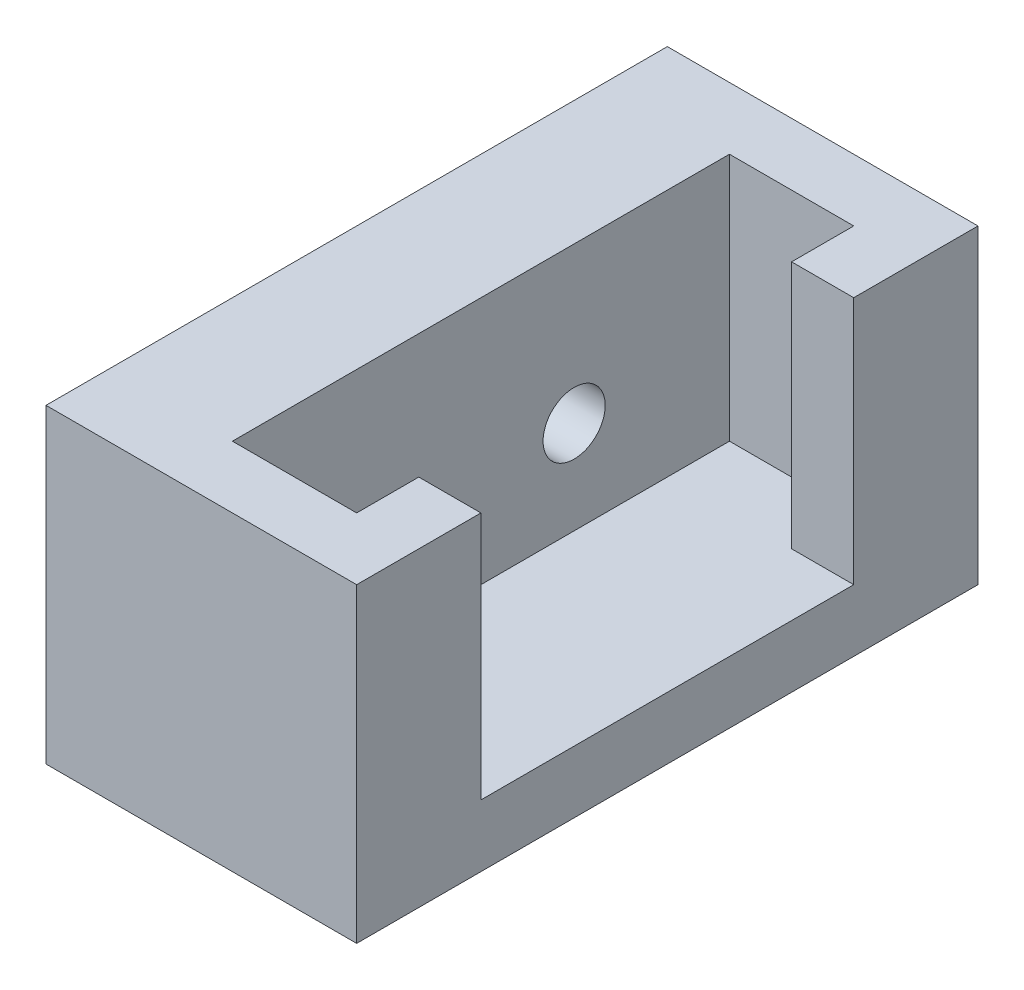
ISO-10303-21;
HEADER;
FILE_DESCRIPTION(('STEP AP214'),'2;1');
FILE_NAME('part.step','',(''),(''),'','','');
FILE_SCHEMA(('AUTOMOTIVE_DESIGN { 1 0 10303 214 1 1 1 1 }'));
ENDSEC;
DATA;
#1=APPLICATION_CONTEXT('core data for automotive mechanical design processes');
#2=APPLICATION_PROTOCOL_DEFINITION('international standard','automotive_design',2000,#1);
#3=PRODUCT_CONTEXT('',#1,'mechanical');
#4=PRODUCT('Part','Part','',(#3));
#5=PRODUCT_RELATED_PRODUCT_CATEGORY('part','',(#4));
#6=PRODUCT_DEFINITION_FORMATION('','',#4);
#7=PRODUCT_DEFINITION_CONTEXT('part definition',#1,'design');
#8=PRODUCT_DEFINITION('design','',#6,#7);
#9=PRODUCT_DEFINITION_SHAPE('','',#8);
#10=(LENGTH_UNIT() NAMED_UNIT(*) SI_UNIT(.MILLI.,.METRE.));
#11=(NAMED_UNIT(*) PLANE_ANGLE_UNIT() SI_UNIT($,.RADIAN.));
#12=(NAMED_UNIT(*) SI_UNIT($,.STERADIAN.) SOLID_ANGLE_UNIT());
#13=UNCERTAINTY_MEASURE_WITH_UNIT(LENGTH_MEASURE(1.E-05),#10,'distance_accuracy_value','');
#14=(GEOMETRIC_REPRESENTATION_CONTEXT(3) GLOBAL_UNCERTAINTY_ASSIGNED_CONTEXT((#13)) GLOBAL_UNIT_ASSIGNED_CONTEXT((#10,
#11,#12)) REPRESENTATION_CONTEXT('',''));
#15=CARTESIAN_POINT('',(0.,0.,0.));
#16=DIRECTION('',(0.,0.,1.));
#17=DIRECTION('',(1.,0.,0.));
#18=AXIS2_PLACEMENT_3D('',#15,#16,#17);
#19=CARTESIAN_POINT('',(150.,-35.,40.));
#20=DIRECTION('',(0.,0.,1.));
#21=DIRECTION('',(1.,0.,0.));
#22=AXIS2_PLACEMENT_3D('',#19,#20,#21);
#23=PLANE('',#22);
#24=DIRECTION('',(1.,0.,0.));
#25=VECTOR('',#24,1.);
#26=CARTESIAN_POINT('',(150.,-55.,40.));
#27=LINE('',#26,#25);
#28=CARTESIAN_POINT('',(145.,-55.,40.));
#29=VERTEX_POINT('',#28);
#30=CARTESIAN_POINT('',(150.,-55.,40.));
#31=VERTEX_POINT('',#30);
#32=EDGE_CURVE('E64',#29,#31,#27,.T.);
#33=ORIENTED_EDGE('',*,*,#32,.F.);
#34=DIRECTION('',(0.,-1.,0.));
#35=VECTOR('',#34,1.);
#36=CARTESIAN_POINT('',(145.,-35.,40.));
#37=LINE('',#36,#35);
#38=CARTESIAN_POINT('',(145.,-35.,40.));
#39=VERTEX_POINT('',#38);
#40=EDGE_CURVE('E191',#39,#29,#37,.T.);
#41=ORIENTED_EDGE('',*,*,#40,.F.);
#42=DIRECTION('',(-1.,0.,0.));
#43=VECTOR('',#42,1.);
#44=CARTESIAN_POINT('',(150.,-35.,40.));
#45=LINE('',#44,#43);
#46=CARTESIAN_POINT('',(150.,-35.,40.));
#47=VERTEX_POINT('',#46);
#48=EDGE_CURVE('E241',#47,#39,#45,.T.);
#49=ORIENTED_EDGE('',*,*,#48,.F.);
#50=DIRECTION('',(0.,-1.,0.));
#51=VECTOR('',#50,1.);
#52=CARTESIAN_POINT('',(150.,-35.,40.));
#53=LINE('',#52,#51);
#54=EDGE_CURVE('E60',#47,#31,#53,.T.);
#55=ORIENTED_EDGE('',*,*,#54,.T.);
#56=EDGE_LOOP('',(#33,#41,#49,#55));
#57=FACE_BOUND('',#56,.T.);
#58=ADVANCED_FACE('F43',(#57),#23,.F.);
#59=CARTESIAN_POINT('',(145.,-35.,40.));
#60=DIRECTION('',(1.,0.,0.));
#61=DIRECTION('',(0.,0.,-1.));
#62=AXIS2_PLACEMENT_3D('',#59,#60,#61);
#63=PLANE('',#62);
#64=DIRECTION('',(0.,0.,-1.));
#65=VECTOR('',#64,1.);
#66=CARTESIAN_POINT('',(145.,-55.,40.));
#67=LINE('',#66,#65);
#68=CARTESIAN_POINT('',(145.,-55.,45.));
#69=VERTEX_POINT('',#68);
#70=EDGE_CURVE('E162',#69,#29,#67,.T.);
#71=ORIENTED_EDGE('',*,*,#70,.F.);
#72=DIRECTION('',(0.,-1.,0.));
#73=VECTOR('',#72,1.);
#74=CARTESIAN_POINT('',(145.,-35.,45.));
#75=LINE('',#74,#73);
#76=CARTESIAN_POINT('',(145.,-35.,45.));
#77=VERTEX_POINT('',#76);
#78=EDGE_CURVE('E188',#77,#69,#75,.T.);
#79=ORIENTED_EDGE('',*,*,#78,.F.);
#80=DIRECTION('',(0.,0.,1.));
#81=VECTOR('',#80,1.);
#82=CARTESIAN_POINT('',(145.,-35.,40.));
#83=LINE('',#82,#81);
#84=EDGE_CURVE('E243',#39,#77,#83,.T.);
#85=ORIENTED_EDGE('',*,*,#84,.F.);
#86=ORIENTED_EDGE('',*,*,#40,.T.);
#87=EDGE_LOOP('',(#71,#79,#85,#86));
#88=FACE_BOUND('',#87,.T.);
#89=ADVANCED_FACE('F279',(#88),#63,.F.);
#90=CARTESIAN_POINT('',(145.,-35.,45.));
#91=DIRECTION('',(0.,0.,1.));
#92=DIRECTION('',(1.,0.,0.));
#93=AXIS2_PLACEMENT_3D('',#90,#91,#92);
#94=PLANE('',#93);
#95=DIRECTION('',(1.,0.,0.));
#96=VECTOR('',#95,1.);
#97=CARTESIAN_POINT('',(145.,-55.,45.));
#98=LINE('',#97,#96);
#99=CARTESIAN_POINT('',(135.,-55.,45.));
#100=VERTEX_POINT('',#99);
#101=EDGE_CURVE('E235',#100,#69,#98,.T.);
#102=ORIENTED_EDGE('',*,*,#101,.F.);
#103=DIRECTION('',(0.,-1.,0.));
#104=VECTOR('',#103,1.);
#105=CARTESIAN_POINT('',(135.,-35.,45.));
#106=LINE('',#105,#104);
#107=CARTESIAN_POINT('',(135.,-35.,45.));
#108=VERTEX_POINT('',#107);
#109=EDGE_CURVE('E185',#108,#100,#106,.T.);
#110=ORIENTED_EDGE('',*,*,#109,.F.);
#111=DIRECTION('',(-1.,0.,0.));
#112=VECTOR('',#111,1.);
#113=CARTESIAN_POINT('',(145.,-35.,45.));
#114=LINE('',#113,#112);
#115=EDGE_CURVE('E245',#77,#108,#114,.T.);
#116=ORIENTED_EDGE('',*,*,#115,.F.);
#117=ORIENTED_EDGE('',*,*,#78,.T.);
#118=EDGE_LOOP('',(#102,#110,#116,#117));
#119=FACE_BOUND('',#118,.T.);
#120=ADVANCED_FACE('F285',(#119),#94,.F.);
#121=CARTESIAN_POINT('',(135.,-35.,45.));
#122=DIRECTION('',(-1.,0.,0.));
#123=DIRECTION('',(0.,0.,1.));
#124=AXIS2_PLACEMENT_3D('',#121,#122,#123);
#125=PLANE('',#124);
#126=CARTESIAN_POINT('',(135.,-47.5,17.5));
#127=DIRECTION('',(1.,0.,0.));
#128=DIRECTION('',(0.,0.,1.));
#129=AXIS2_PLACEMENT_3D('',#126,#127,#128);
#130=CIRCLE('',#129,2.5);
#131=CARTESIAN_POINT('',(135.,-47.5,20.));
#132=VERTEX_POINT('',#131);
#133=EDGE_CURVE('E209',#132,#132,#130,.T.);
#134=ORIENTED_EDGE('',*,*,#133,.F.);
#135=EDGE_LOOP('',(#134));
#136=FACE_BOUND('',#135,.T.);
#137=CARTESIAN_POINT('',(135.,-47.5,32.5));
#138=DIRECTION('',(1.,0.,0.));
#139=DIRECTION('',(0.,0.,1.));
#140=AXIS2_PLACEMENT_3D('',#137,#138,#139);
#141=CIRCLE('',#140,2.5);
#142=CARTESIAN_POINT('',(135.,-47.5,35.));
#143=VERTEX_POINT('',#142);
#144=EDGE_CURVE('E216',#143,#143,#141,.T.);
#145=ORIENTED_EDGE('',*,*,#144,.F.);
#146=EDGE_LOOP('',(#145));
#147=FACE_BOUND('',#146,.T.);
#148=DIRECTION('',(0.,0.,1.));
#149=VECTOR('',#148,1.);
#150=CARTESIAN_POINT('',(135.,-55.,45.));
#151=LINE('',#150,#149);
#152=CARTESIAN_POINT('',(135.,-55.,5.));
#153=VERTEX_POINT('',#152);
#154=EDGE_CURVE('E232',#153,#100,#151,.T.);
#155=ORIENTED_EDGE('',*,*,#154,.F.);
#156=DIRECTION('',(0.,-1.,0.));
#157=VECTOR('',#156,1.);
#158=CARTESIAN_POINT('',(135.,-35.,5.));
#159=LINE('',#158,#157);
#160=CARTESIAN_POINT('',(135.,-35.,5.));
#161=VERTEX_POINT('',#160);
#162=EDGE_CURVE('E182',#161,#153,#159,.T.);
#163=ORIENTED_EDGE('',*,*,#162,.F.);
#164=DIRECTION('',(0.,0.,-1.));
#165=VECTOR('',#164,1.);
#166=CARTESIAN_POINT('',(135.,-35.,45.));
#167=LINE('',#166,#165);
#168=EDGE_CURVE('E247',#108,#161,#167,.T.);
#169=ORIENTED_EDGE('',*,*,#168,.F.);
#170=ORIENTED_EDGE('',*,*,#109,.T.);
#171=EDGE_LOOP('',(#155,#163,#169,#170));
#172=FACE_BOUND('',#171,.T.);
#173=ADVANCED_FACE('F341',(#136,#147,#172),#125,.F.);
#174=CARTESIAN_POINT('',(135.,-35.,5.));
#175=DIRECTION('',(0.,0.,-1.));
#176=DIRECTION('',(-1.,0.,0.));
#177=AXIS2_PLACEMENT_3D('',#174,#175,#176);
#178=PLANE('',#177);
#179=DIRECTION('',(-1.,0.,0.));
#180=VECTOR('',#179,1.);
#181=CARTESIAN_POINT('',(135.,-55.,5.));
#182=LINE('',#181,#180);
#183=CARTESIAN_POINT('',(145.,-55.,5.));
#184=VERTEX_POINT('',#183);
#185=EDGE_CURVE('E229',#184,#153,#182,.T.);
#186=ORIENTED_EDGE('',*,*,#185,.F.);
#187=DIRECTION('',(0.,-1.,0.));
#188=VECTOR('',#187,1.);
#189=CARTESIAN_POINT('',(145.,-35.,5.));
#190=LINE('',#189,#188);
#191=CARTESIAN_POINT('',(145.,-35.,5.));
#192=VERTEX_POINT('',#191);
#193=EDGE_CURVE('E179',#192,#184,#190,.T.);
#194=ORIENTED_EDGE('',*,*,#193,.F.);
#195=DIRECTION('',(1.,0.,0.));
#196=VECTOR('',#195,1.);
#197=CARTESIAN_POINT('',(135.,-35.,5.));
#198=LINE('',#197,#196);
#199=EDGE_CURVE('E249',#161,#192,#198,.T.);
#200=ORIENTED_EDGE('',*,*,#199,.F.);
#201=ORIENTED_EDGE('',*,*,#162,.T.);
#202=EDGE_LOOP('',(#186,#194,#200,#201));
#203=FACE_BOUND('',#202,.T.);
#204=ADVANCED_FACE('F344',(#203),#178,.F.);
#205=CARTESIAN_POINT('',(145.,-35.,5.));
#206=DIRECTION('',(1.,0.,0.));
#207=DIRECTION('',(0.,0.,-1.));
#208=AXIS2_PLACEMENT_3D('',#205,#206,#207);
#209=PLANE('',#208);
#210=DIRECTION('',(0.,0.,-1.));
#211=VECTOR('',#210,1.);
#212=CARTESIAN_POINT('',(145.,-55.,5.));
#213=LINE('',#212,#211);
#214=CARTESIAN_POINT('',(145.,-55.,9.99999999999999));
#215=VERTEX_POINT('',#214);
#216=EDGE_CURVE('E226',#215,#184,#213,.T.);
#217=ORIENTED_EDGE('',*,*,#216,.F.);
#218=DIRECTION('',(0.,-1.,0.));
#219=VECTOR('',#218,1.);
#220=CARTESIAN_POINT('',(145.,-35.,9.99999999999999));
#221=LINE('',#220,#219);
#222=CARTESIAN_POINT('',(145.,-35.,9.99999999999999));
#223=VERTEX_POINT('',#222);
#224=EDGE_CURVE('E176',#223,#215,#221,.T.);
#225=ORIENTED_EDGE('',*,*,#224,.F.);
#226=DIRECTION('',(0.,0.,1.));
#227=VECTOR('',#226,1.);
#228=CARTESIAN_POINT('',(145.,-35.,5.));
#229=LINE('',#228,#227);
#230=EDGE_CURVE('E251',#192,#223,#229,.T.);
#231=ORIENTED_EDGE('',*,*,#230,.F.);
#232=ORIENTED_EDGE('',*,*,#193,.T.);
#233=EDGE_LOOP('',(#217,#225,#231,#232));
#234=FACE_BOUND('',#233,.T.);
#235=ADVANCED_FACE('F303',(#234),#209,.F.);
#236=CARTESIAN_POINT('',(145.,-35.,9.99999999999999));
#237=DIRECTION('',(0.,0.,-1.));
#238=DIRECTION('',(-1.,0.,0.));
#239=AXIS2_PLACEMENT_3D('',#236,#237,#238);
#240=PLANE('',#239);
#241=DIRECTION('',(-1.,0.,0.));
#242=VECTOR('',#241,1.);
#243=CARTESIAN_POINT('',(145.,-55.,9.99999999999999));
#244=LINE('',#243,#242);
#245=CARTESIAN_POINT('',(150.,-55.,9.99999999999999));
#246=VERTEX_POINT('',#245);
#247=EDGE_CURVE('E223',#246,#215,#244,.T.);
#248=ORIENTED_EDGE('',*,*,#247,.F.);
#249=DIRECTION('',(0.,-1.,0.));
#250=VECTOR('',#249,1.);
#251=CARTESIAN_POINT('',(150.,-35.,9.99999999999999));
#252=LINE('',#251,#250);
#253=CARTESIAN_POINT('',(150.,-35.,9.99999999999999));
#254=VERTEX_POINT('',#253);
#255=EDGE_CURVE('E173',#254,#246,#252,.T.);
#256=ORIENTED_EDGE('',*,*,#255,.F.);
#257=DIRECTION('',(1.,0.,0.));
#258=VECTOR('',#257,1.);
#259=CARTESIAN_POINT('',(145.,-35.,9.99999999999999));
#260=LINE('',#259,#258);
#261=EDGE_CURVE('E253',#223,#254,#260,.T.);
#262=ORIENTED_EDGE('',*,*,#261,.F.);
#263=ORIENTED_EDGE('',*,*,#224,.T.);
#264=EDGE_LOOP('',(#248,#256,#262,#263));
#265=FACE_BOUND('',#264,.T.);
#266=ADVANCED_FACE('F297',(#265),#240,.F.);
#267=CARTESIAN_POINT('',(125.,-35.,0.));
#268=DIRECTION('',(1.,0.,0.));
#269=DIRECTION('',(0.,0.,-1.));
#270=AXIS2_PLACEMENT_3D('',#267,#268,#269);
#271=PLANE('',#270);
#272=CARTESIAN_POINT('',(125.,-47.5,32.5));
#273=DIRECTION('',(1.,0.,0.));
#274=DIRECTION('',(0.,0.,-1.));
#275=AXIS2_PLACEMENT_3D('',#272,#273,#274);
#276=CIRCLE('',#275,1.75);
#277=CARTESIAN_POINT('',(125.,-47.5,30.75));
#278=VERTEX_POINT('',#277);
#279=EDGE_CURVE('E47',#278,#278,#276,.T.);
#280=ORIENTED_EDGE('',*,*,#279,.T.);
#281=EDGE_LOOP('',(#280));
#282=FACE_BOUND('',#281,.T.);
#283=CARTESIAN_POINT('',(125.,-47.5,17.5));
#284=DIRECTION('',(1.,0.,0.));
#285=DIRECTION('',(0.,0.,-1.));
#286=AXIS2_PLACEMENT_3D('',#283,#284,#285);
#287=CIRCLE('',#286,1.75);
#288=CARTESIAN_POINT('',(125.,-47.5,15.75));
#289=VERTEX_POINT('',#288);
#290=EDGE_CURVE('E194',#289,#289,#287,.T.);
#291=ORIENTED_EDGE('',*,*,#290,.T.);
#292=EDGE_LOOP('',(#291));
#293=FACE_BOUND('',#292,.T.);
#294=DIRECTION('',(0.,0.,1.));
#295=VECTOR('',#294,1.);
#296=CARTESIAN_POINT('',(125.,-60.,0.));
#297=LINE('',#296,#295);
#298=CARTESIAN_POINT('',(125.,-60.,0.));
#299=VERTEX_POINT('',#298);
#300=CARTESIAN_POINT('',(125.,-60.,50.));
#301=VERTEX_POINT('',#300);
#302=EDGE_CURVE('E153',#299,#301,#297,.T.);
#303=ORIENTED_EDGE('',*,*,#302,.T.);
#304=DIRECTION('',(0.,-1.,0.));
#305=VECTOR('',#304,1.);
#306=CARTESIAN_POINT('',(125.,-35.,50.));
#307=LINE('',#306,#305);
#308=CARTESIAN_POINT('',(125.,-35.,50.));
#309=VERTEX_POINT('',#308);
#310=EDGE_CURVE('E11',#309,#301,#307,.T.);
#311=ORIENTED_EDGE('',*,*,#310,.F.);
#312=DIRECTION('',(0.,0.,1.));
#313=VECTOR('',#312,1.);
#314=CARTESIAN_POINT('',(125.,-35.,0.));
#315=LINE('',#314,#313);
#316=CARTESIAN_POINT('',(125.,-35.,0.));
#317=VERTEX_POINT('',#316);
#318=EDGE_CURVE('E141',#317,#309,#315,.T.);
#319=ORIENTED_EDGE('',*,*,#318,.F.);
#320=DIRECTION('',(0.,-1.,0.));
#321=VECTOR('',#320,1.);
#322=CARTESIAN_POINT('',(125.,-35.,0.));
#323=LINE('',#322,#321);
#324=EDGE_CURVE('E154',#317,#299,#323,.T.);
#325=ORIENTED_EDGE('',*,*,#324,.T.);
#326=EDGE_LOOP('',(#303,#311,#319,#325));
#327=FACE_BOUND('',#326,.T.);
#328=ADVANCED_FACE('F45',(#282,#293,#327),#271,.F.);
#329=CARTESIAN_POINT('',(125.,-35.,50.));
#330=DIRECTION('',(0.,0.,-1.));
#331=DIRECTION('',(-1.,0.,0.));
#332=AXIS2_PLACEMENT_3D('',#329,#330,#331);
#333=PLANE('',#332);
#334=DIRECTION('',(1.,0.,0.));
#335=VECTOR('',#334,1.);
#336=CARTESIAN_POINT('',(125.,-60.,50.));
#337=LINE('',#336,#335);
#338=CARTESIAN_POINT('',(150.,-60.,50.));
#339=VERTEX_POINT('',#338);
#340=EDGE_CURVE('E158',#301,#339,#337,.T.);
#341=ORIENTED_EDGE('',*,*,#340,.T.);
#342=DIRECTION('',(0.,-1.,0.));
#343=VECTOR('',#342,1.);
#344=CARTESIAN_POINT('',(150.,-35.,50.));
#345=LINE('',#344,#343);
#346=CARTESIAN_POINT('',(150.,-35.,50.));
#347=VERTEX_POINT('',#346);
#348=EDGE_CURVE('E52',#347,#339,#345,.T.);
#349=ORIENTED_EDGE('',*,*,#348,.F.);
#350=DIRECTION('',(1.,0.,0.));
#351=VECTOR('',#350,1.);
#352=CARTESIAN_POINT('',(125.,-35.,50.));
#353=LINE('',#352,#351);
#354=EDGE_CURVE('E132',#309,#347,#353,.T.);
#355=ORIENTED_EDGE('',*,*,#354,.F.);
#356=ORIENTED_EDGE('',*,*,#310,.T.);
#357=EDGE_LOOP('',(#341,#349,#355,#356));
#358=FACE_BOUND('',#357,.T.);
#359=ADVANCED_FACE('F135',(#358),#333,.F.);
#360=CARTESIAN_POINT('',(150.,-35.,9.99999999999999));
#361=DIRECTION('',(-1.,0.,0.));
#362=DIRECTION('',(0.,0.,1.));
#363=AXIS2_PLACEMENT_3D('',#360,#361,#362);
#364=PLANE('',#363);
#365=DIRECTION('',(0.,0.,-1.));
#366=VECTOR('',#365,1.);
#367=CARTESIAN_POINT('',(150.,-60.,9.99999999999999));
#368=LINE('',#367,#366);
#369=CARTESIAN_POINT('',(150.,-60.,0.));
#370=VERTEX_POINT('',#369);
#371=EDGE_CURVE('E160',#339,#370,#368,.T.);
#372=ORIENTED_EDGE('',*,*,#371,.T.);
#373=DIRECTION('',(0.,-1.,0.));
#374=VECTOR('',#373,1.);
#375=CARTESIAN_POINT('',(150.,-35.,0.));
#376=LINE('',#375,#374);
#377=CARTESIAN_POINT('',(150.,-35.,0.));
#378=VERTEX_POINT('',#377);
#379=EDGE_CURVE('E171',#378,#370,#376,.T.);
#380=ORIENTED_EDGE('',*,*,#379,.F.);
#381=DIRECTION('',(0.,0.,-1.));
#382=VECTOR('',#381,1.);
#383=CARTESIAN_POINT('',(150.,-35.,9.99999999999999));
#384=LINE('',#383,#382);
#385=EDGE_CURVE('E254',#254,#378,#384,.T.);
#386=ORIENTED_EDGE('',*,*,#385,.F.);
#387=ORIENTED_EDGE('',*,*,#255,.T.);
#388=DIRECTION('',(0.,0.,1.));
#389=VECTOR('',#388,1.);
#390=CARTESIAN_POINT('',(150.,-55.,0.));
#391=LINE('',#390,#389);
#392=EDGE_CURVE('E212',#246,#31,#391,.T.);
#393=ORIENTED_EDGE('',*,*,#392,.T.);
#394=ORIENTED_EDGE('',*,*,#54,.F.);
#395=DIRECTION('',(0.,0.,-1.));
#396=VECTOR('',#395,1.);
#397=CARTESIAN_POINT('',(150.,-35.,50.));
#398=LINE('',#397,#396);
#399=EDGE_CURVE('E140',#347,#47,#398,.T.);
#400=ORIENTED_EDGE('',*,*,#399,.F.);
#401=ORIENTED_EDGE('',*,*,#348,.T.);
#402=EDGE_LOOP('',(#372,#380,#386,#387,#393,#394,#400,#401));
#403=FACE_BOUND('',#402,.T.);
#404=ADVANCED_FACE('F260',(#403),#364,.F.);
#405=CARTESIAN_POINT('',(150.,-35.,0.));
#406=DIRECTION('',(0.,0.,1.));
#407=DIRECTION('',(1.,0.,0.));
#408=AXIS2_PLACEMENT_3D('',#405,#406,#407);
#409=PLANE('',#408);
#410=DIRECTION('',(-1.,0.,0.));
#411=VECTOR('',#410,1.);
#412=CARTESIAN_POINT('',(150.,-60.,0.));
#413=LINE('',#412,#411);
#414=EDGE_CURVE('E149',#370,#299,#413,.T.);
#415=ORIENTED_EDGE('',*,*,#414,.T.);
#416=ORIENTED_EDGE('',*,*,#324,.F.);
#417=DIRECTION('',(-1.,0.,0.));
#418=VECTOR('',#417,1.);
#419=CARTESIAN_POINT('',(150.,-35.,0.));
#420=LINE('',#419,#418);
#421=EDGE_CURVE('E146',#378,#317,#420,.T.);
#422=ORIENTED_EDGE('',*,*,#421,.F.);
#423=ORIENTED_EDGE('',*,*,#379,.T.);
#424=EDGE_LOOP('',(#415,#416,#422,#423));
#425=FACE_BOUND('',#424,.T.);
#426=ADVANCED_FACE('F263',(#425),#409,.F.);
#427=CARTESIAN_POINT('',(0.,-35.,0.));
#428=DIRECTION('',(0.,1.,0.));
#429=DIRECTION('',(0.,0.,1.));
#430=AXIS2_PLACEMENT_3D('',#427,#428,#429);
#431=PLANE('',#430);
#432=ORIENTED_EDGE('',*,*,#318,.T.);
#433=ORIENTED_EDGE('',*,*,#354,.T.);
#434=ORIENTED_EDGE('',*,*,#399,.T.);
#435=ORIENTED_EDGE('',*,*,#48,.T.);
#436=ORIENTED_EDGE('',*,*,#84,.T.);
#437=ORIENTED_EDGE('',*,*,#115,.T.);
#438=ORIENTED_EDGE('',*,*,#168,.T.);
#439=ORIENTED_EDGE('',*,*,#199,.T.);
#440=ORIENTED_EDGE('',*,*,#230,.T.);
#441=ORIENTED_EDGE('',*,*,#261,.T.);
#442=ORIENTED_EDGE('',*,*,#385,.T.);
#443=ORIENTED_EDGE('',*,*,#421,.T.);
#444=EDGE_LOOP('',(#432,#433,#434,#435,#436,#437,#438,#439,#440,#441,#442,#443));
#445=FACE_BOUND('',#444,.T.);
#446=ADVANCED_FACE('F144',(#445),#431,.T.);
#447=CARTESIAN_POINT('',(0.,-60.,0.));
#448=DIRECTION('',(0.,1.,0.));
#449=DIRECTION('',(0.,0.,1.));
#450=AXIS2_PLACEMENT_3D('',#447,#448,#449);
#451=PLANE('',#450);
#452=ORIENTED_EDGE('',*,*,#302,.F.);
#453=ORIENTED_EDGE('',*,*,#414,.F.);
#454=ORIENTED_EDGE('',*,*,#371,.F.);
#455=ORIENTED_EDGE('',*,*,#340,.F.);
#456=EDGE_LOOP('',(#452,#453,#454,#455));
#457=FACE_BOUND('',#456,.T.);
#458=ADVANCED_FACE('F264',(#457),#451,.F.);
#459=CARTESIAN_POINT('',(0.,-55.,0.));
#460=DIRECTION('',(0.,-1.,0.));
#461=DIRECTION('',(0.,0.,-1.));
#462=AXIS2_PLACEMENT_3D('',#459,#460,#461);
#463=PLANE('',#462);
#464=ORIENTED_EDGE('',*,*,#70,.T.);
#465=ORIENTED_EDGE('',*,*,#32,.T.);
#466=ORIENTED_EDGE('',*,*,#392,.F.);
#467=ORIENTED_EDGE('',*,*,#247,.T.);
#468=ORIENTED_EDGE('',*,*,#216,.T.);
#469=ORIENTED_EDGE('',*,*,#185,.T.);
#470=ORIENTED_EDGE('',*,*,#154,.T.);
#471=ORIENTED_EDGE('',*,*,#101,.T.);
#472=EDGE_LOOP('',(#464,#465,#466,#467,#468,#469,#470,#471));
#473=FACE_BOUND('',#472,.T.);
#474=ADVANCED_FACE('F266',(#473),#463,.F.);
#475=CARTESIAN_POINT('',(130.,-47.5,32.5));
#476=DIRECTION('',(1.,0.,0.));
#477=DIRECTION('',(0.,0.,-1.));
#478=AXIS2_PLACEMENT_3D('',#475,#476,#477);
#479=CYLINDRICAL_SURFACE('',#478,2.5);
#480=CARTESIAN_POINT('',(130.,-47.5,32.5));
#481=DIRECTION('',(1.,0.,0.));
#482=DIRECTION('',(0.,0.,1.));
#483=AXIS2_PLACEMENT_3D('',#480,#481,#482);
#484=CIRCLE('',#483,2.5);
#485=CARTESIAN_POINT('',(130.,-47.5,35.));
#486=VERTEX_POINT('',#485);
#487=EDGE_CURVE('E200',#486,#486,#484,.T.);
#488=ORIENTED_EDGE('',*,*,#487,.F.);
#489=EDGE_LOOP('',(#488));
#490=FACE_BOUND('',#489,.T.);
#491=ORIENTED_EDGE('',*,*,#144,.T.);
#492=EDGE_LOOP('',(#491));
#493=FACE_BOUND('',#492,.T.);
#494=ADVANCED_FACE('F272',(#490,#493),#479,.F.);
#495=CARTESIAN_POINT('',(130.,-47.5,32.5));
#496=DIRECTION('',(-1.,0.,0.));
#497=DIRECTION('',(0.,0.,1.));
#498=AXIS2_PLACEMENT_3D('',#495,#496,#497);
#499=PLANE('',#498);
#500=CARTESIAN_POINT('',(130.,-47.5,32.5));
#501=DIRECTION('',(1.,0.,0.));
#502=DIRECTION('',(0.,0.,-1.));
#503=AXIS2_PLACEMENT_3D('',#500,#501,#502);
#504=CIRCLE('',#503,1.75);
#505=CARTESIAN_POINT('',(130.,-47.5,30.75));
#506=VERTEX_POINT('',#505);
#507=EDGE_CURVE('E196',#506,#506,#504,.T.);
#508=ORIENTED_EDGE('',*,*,#507,.F.);
#509=EDGE_LOOP('',(#508));
#510=FACE_BOUND('',#509,.T.);
#511=ORIENTED_EDGE('',*,*,#487,.T.);
#512=EDGE_LOOP('',(#511));
#513=FACE_BOUND('',#512,.T.);
#514=ADVANCED_FACE('F323',(#510,#513),#499,.F.);
#515=CARTESIAN_POINT('',(130.,-47.5,17.5));
#516=DIRECTION('',(1.,0.,0.));
#517=DIRECTION('',(0.,0.,-1.));
#518=AXIS2_PLACEMENT_3D('',#515,#516,#517);
#519=CYLINDRICAL_SURFACE('',#518,2.5);
#520=CARTESIAN_POINT('',(130.,-47.5,17.5));
#521=DIRECTION('',(1.,0.,0.));
#522=DIRECTION('',(0.,0.,1.));
#523=AXIS2_PLACEMENT_3D('',#520,#521,#522);
#524=CIRCLE('',#523,2.5);
#525=CARTESIAN_POINT('',(130.,-47.5,20.));
#526=VERTEX_POINT('',#525);
#527=EDGE_CURVE('E213',#526,#526,#524,.T.);
#528=ORIENTED_EDGE('',*,*,#527,.F.);
#529=EDGE_LOOP('',(#528));
#530=FACE_BOUND('',#529,.T.);
#531=ORIENTED_EDGE('',*,*,#133,.T.);
#532=EDGE_LOOP('',(#531));
#533=FACE_BOUND('',#532,.T.);
#534=ADVANCED_FACE('F320',(#530,#533),#519,.F.);
#535=CARTESIAN_POINT('',(130.,-47.5,17.5));
#536=DIRECTION('',(-1.,0.,0.));
#537=DIRECTION('',(0.,0.,1.));
#538=AXIS2_PLACEMENT_3D('',#535,#536,#537);
#539=PLANE('',#538);
#540=CARTESIAN_POINT('',(130.,-47.5,17.5));
#541=DIRECTION('',(1.,0.,0.));
#542=DIRECTION('',(0.,0.,-1.));
#543=AXIS2_PLACEMENT_3D('',#540,#541,#542);
#544=CIRCLE('',#543,1.75);
#545=CARTESIAN_POINT('',(130.,-47.5,15.75));
#546=VERTEX_POINT('',#545);
#547=EDGE_CURVE('E202',#546,#546,#544,.T.);
#548=ORIENTED_EDGE('',*,*,#547,.F.);
#549=EDGE_LOOP('',(#548));
#550=FACE_BOUND('',#549,.T.);
#551=ORIENTED_EDGE('',*,*,#527,.T.);
#552=EDGE_LOOP('',(#551));
#553=FACE_BOUND('',#552,.T.);
#554=ADVANCED_FACE('F316',(#550,#553),#539,.F.);
#555=CARTESIAN_POINT('',(119.,-47.5,17.5));
#556=DIRECTION('',(1.,0.,0.));
#557=DIRECTION('',(0.,0.,-1.));
#558=AXIS2_PLACEMENT_3D('',#555,#556,#557);
#559=CYLINDRICAL_SURFACE('',#558,1.75);
#560=ORIENTED_EDGE('',*,*,#547,.T.);
#561=EDGE_LOOP('',(#560));
#562=FACE_BOUND('',#561,.T.);
#563=ORIENTED_EDGE('',*,*,#290,.F.);
#564=EDGE_LOOP('',(#563));
#565=FACE_BOUND('',#564,.T.);
#566=ADVANCED_FACE('F310',(#562,#565),#559,.F.);
#567=CARTESIAN_POINT('',(119.,-47.5,32.5));
#568=DIRECTION('',(1.,0.,0.));
#569=DIRECTION('',(0.,0.,-1.));
#570=AXIS2_PLACEMENT_3D('',#567,#568,#569);
#571=CYLINDRICAL_SURFACE('',#570,1.75);
#572=ORIENTED_EDGE('',*,*,#507,.T.);
#573=EDGE_LOOP('',(#572));
#574=FACE_BOUND('',#573,.T.);
#575=ORIENTED_EDGE('',*,*,#279,.F.);
#576=EDGE_LOOP('',(#575));
#577=FACE_BOUND('',#576,.T.);
#578=ADVANCED_FACE('F308',(#574,#577),#571,.F.);
#579=CLOSED_SHELL('',(#58,#89,#120,#173,#204,#235,#266,#328,#359,#404,#426,#446,#458,#474,#494,
#514,#534,#554,#566,#578));
#580=MANIFOLD_SOLID_BREP('B2',#579);
#581=ADVANCED_BREP_SHAPE_REPRESENTATION('',(#18,#580),#14);
#582=SHAPE_DEFINITION_REPRESENTATION(#9,#581);
ENDSEC;
END-ISO-10303-21;
